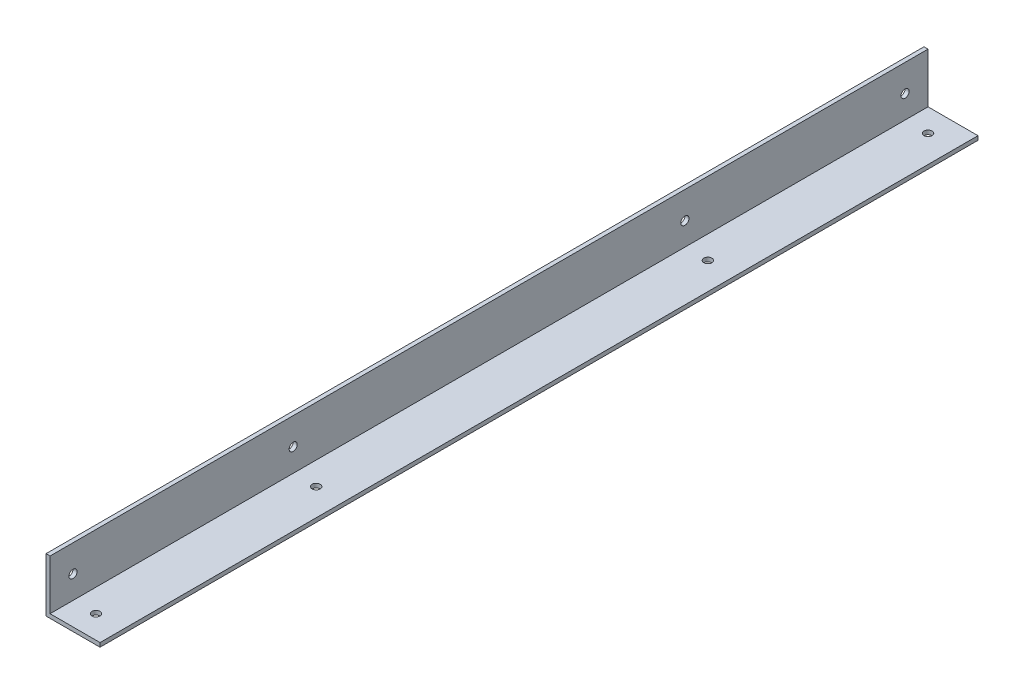
ISO-10303-21;
HEADER;
FILE_DESCRIPTION(('STEP AP214'),'2;1');
FILE_NAME('part.step','',(''),(''),'','','');
FILE_SCHEMA(('AUTOMOTIVE_DESIGN { 1 0 10303 214 1 1 1 1 }'));
ENDSEC;
DATA;
#1=APPLICATION_CONTEXT('core data for automotive mechanical design processes');
#2=APPLICATION_PROTOCOL_DEFINITION('international standard','automotive_design',2000,#1);
#3=PRODUCT_CONTEXT('',#1,'mechanical');
#4=PRODUCT('Part','Part','',(#3));
#5=PRODUCT_RELATED_PRODUCT_CATEGORY('part','',(#4));
#6=PRODUCT_DEFINITION_FORMATION('','',#4);
#7=PRODUCT_DEFINITION_CONTEXT('part definition',#1,'design');
#8=PRODUCT_DEFINITION('design','',#6,#7);
#9=PRODUCT_DEFINITION_SHAPE('','',#8);
#10=(LENGTH_UNIT() NAMED_UNIT(*) SI_UNIT(.MILLI.,.METRE.));
#11=(NAMED_UNIT(*) PLANE_ANGLE_UNIT() SI_UNIT($,.RADIAN.));
#12=(NAMED_UNIT(*) SI_UNIT($,.STERADIAN.) SOLID_ANGLE_UNIT());
#13=UNCERTAINTY_MEASURE_WITH_UNIT(LENGTH_MEASURE(1.E-05),#10,'distance_accuracy_value','');
#14=(GEOMETRIC_REPRESENTATION_CONTEXT(3) GLOBAL_UNCERTAINTY_ASSIGNED_CONTEXT((#13)) GLOBAL_UNIT_ASSIGNED_CONTEXT((#10,
#11,#12)) REPRESENTATION_CONTEXT('',''));
#15=CARTESIAN_POINT('',(0.,0.,0.));
#16=DIRECTION('',(0.,0.,1.));
#17=DIRECTION('',(1.,0.,0.));
#18=AXIS2_PLACEMENT_3D('',#15,#16,#17);
#19=CARTESIAN_POINT('',(-15.9316863798358,4.77336842105263,325.));
#20=DIRECTION('',(0.,-1.,0.));
#21=DIRECTION('',(1.,0.,0.));
#22=AXIS2_PLACEMENT_3D('',#19,#20,#21);
#23=PLANE('',#22);
#24=DIRECTION('',(-1.,0.,0.));
#25=VECTOR('',#24,1.);
#26=CARTESIAN_POINT('',(-15.9316863798358,4.77336842105263,0.));
#27=LINE('',#26,#25);
#28=CARTESIAN_POINT('',(-15.9316863798358,4.77336842105263,0.));
#29=VERTEX_POINT('',#28);
#30=CARTESIAN_POINT('',(-17.4316863798358,4.77336842105263,0.));
#31=VERTEX_POINT('',#30);
#32=EDGE_CURVE('E114',#29,#31,#27,.T.);
#33=ORIENTED_EDGE('',*,*,#32,.T.);
#34=DIRECTION('',(0.,0.,-1.));
#35=VECTOR('',#34,1.);
#36=CARTESIAN_POINT('',(-17.4316863798358,4.77336842105263,325.));
#37=LINE('',#36,#35);
#38=CARTESIAN_POINT('',(-17.4316863798358,4.77336842105263,325.));
#39=VERTEX_POINT('',#38);
#40=EDGE_CURVE('E11',#39,#31,#37,.T.);
#41=ORIENTED_EDGE('',*,*,#40,.F.);
#42=DIRECTION('',(-1.,0.,0.));
#43=VECTOR('',#42,1.);
#44=CARTESIAN_POINT('',(-15.9316863798358,4.77336842105263,325.));
#45=LINE('',#44,#43);
#46=CARTESIAN_POINT('',(-15.9316863798358,4.77336842105263,325.));
#47=VERTEX_POINT('',#46);
#48=EDGE_CURVE('E125',#47,#39,#45,.T.);
#49=ORIENTED_EDGE('',*,*,#48,.F.);
#50=DIRECTION('',(0.,0.,-1.));
#51=VECTOR('',#50,1.);
#52=CARTESIAN_POINT('',(-15.9316863798358,4.77336842105263,325.));
#53=LINE('',#52,#51);
#54=EDGE_CURVE('E110',#47,#29,#53,.T.);
#55=ORIENTED_EDGE('',*,*,#54,.T.);
#56=EDGE_LOOP('',(#33,#41,#49,#55));
#57=FACE_BOUND('',#56,.T.);
#58=ADVANCED_FACE('F30',(#57),#23,.F.);
#59=CARTESIAN_POINT('',(-17.4316863798358,4.77336842105263,325.));
#60=DIRECTION('',(1.,0.,0.));
#61=DIRECTION('',(0.,1.,0.));
#62=AXIS2_PLACEMENT_3D('',#59,#60,#61);
#63=PLANE('',#62);
#64=CARTESIAN_POINT('',(-17.4316863798358,-5.22663157894737,90.));
#65=DIRECTION('',(1.,0.,0.));
#66=DIRECTION('',(0.,1.,0.));
#67=AXIS2_PLACEMENT_3D('',#64,#65,#66);
#68=CIRCLE('',#67,1.5);
#69=CARTESIAN_POINT('',(-17.4316863798358,-3.72663157894737,90.));
#70=VERTEX_POINT('',#69);
#71=EDGE_CURVE('E287',#70,#70,#68,.T.);
#72=ORIENTED_EDGE('',*,*,#71,.T.);
#73=EDGE_LOOP('',(#72));
#74=FACE_BOUND('',#73,.T.);
#75=CARTESIAN_POINT('',(-17.4316863798358,-5.22663157894737,235.));
#76=DIRECTION('',(1.,0.,0.));
#77=DIRECTION('',(0.,1.,0.));
#78=AXIS2_PLACEMENT_3D('',#75,#76,#77);
#79=CIRCLE('',#78,1.50000000000003);
#80=CARTESIAN_POINT('',(-17.4316863798358,-3.72663157894734,235.));
#81=VERTEX_POINT('',#80);
#82=EDGE_CURVE('E291',#81,#81,#79,.T.);
#83=ORIENTED_EDGE('',*,*,#82,.T.);
#84=EDGE_LOOP('',(#83));
#85=FACE_BOUND('',#84,.T.);
#86=CARTESIAN_POINT('',(-17.4316863798358,-5.22663157894737,8.50000000000001));
#87=DIRECTION('',(1.,0.,0.));
#88=DIRECTION('',(0.,1.,0.));
#89=AXIS2_PLACEMENT_3D('',#86,#87,#88);
#90=CIRCLE('',#89,1.5);
#91=CARTESIAN_POINT('',(-17.4316863798358,-3.72663157894737,8.50000000000001));
#92=VERTEX_POINT('',#91);
#93=EDGE_CURVE('E300',#92,#92,#90,.T.);
#94=ORIENTED_EDGE('',*,*,#93,.T.);
#95=EDGE_LOOP('',(#94));
#96=FACE_BOUND('',#95,.T.);
#97=CARTESIAN_POINT('',(-17.4316863798358,-5.22663157894737,316.5));
#98=DIRECTION('',(1.,0.,0.));
#99=DIRECTION('',(0.,1.,0.));
#100=AXIS2_PLACEMENT_3D('',#97,#98,#99);
#101=CIRCLE('',#100,1.50000000000002);
#102=CARTESIAN_POINT('',(-17.4316863798358,-3.72663157894735,316.5));
#103=VERTEX_POINT('',#102);
#104=EDGE_CURVE('E306',#103,#103,#101,.T.);
#105=ORIENTED_EDGE('',*,*,#104,.T.);
#106=EDGE_LOOP('',(#105));
#107=FACE_BOUND('',#106,.T.);
#108=DIRECTION('',(0.,-1.,0.));
#109=VECTOR('',#108,1.);
#110=CARTESIAN_POINT('',(-17.4316863798358,4.77336842105263,0.));
#111=LINE('',#110,#109);
#112=CARTESIAN_POINT('',(-17.4316863798357,-15.2266315789474,0.));
#113=VERTEX_POINT('',#112);
#114=EDGE_CURVE('E117',#31,#113,#111,.T.);
#115=ORIENTED_EDGE('',*,*,#114,.T.);
#116=DIRECTION('',(0.,0.,-1.));
#117=VECTOR('',#116,1.);
#118=CARTESIAN_POINT('',(-17.4316863798357,-15.2266315789474,325.));
#119=LINE('',#118,#117);
#120=CARTESIAN_POINT('',(-17.4316863798357,-15.2266315789474,325.));
#121=VERTEX_POINT('',#120);
#122=EDGE_CURVE('E38',#121,#113,#119,.T.);
#123=ORIENTED_EDGE('',*,*,#122,.F.);
#124=DIRECTION('',(0.,-1.,0.));
#125=VECTOR('',#124,1.);
#126=CARTESIAN_POINT('',(-17.4316863798358,4.77336842105263,325.));
#127=LINE('',#126,#125);
#128=EDGE_CURVE('E83',#39,#121,#127,.T.);
#129=ORIENTED_EDGE('',*,*,#128,.F.);
#130=ORIENTED_EDGE('',*,*,#40,.T.);
#131=EDGE_LOOP('',(#115,#123,#129,#130));
#132=FACE_BOUND('',#131,.T.);
#133=ADVANCED_FACE('F153',(#74,#85,#96,#107,#132),#63,.F.);
#134=CARTESIAN_POINT('',(-17.4316863798357,-15.2266315789474,325.));
#135=DIRECTION('',(0.,1.,0.));
#136=DIRECTION('',(0.,0.,1.));
#137=AXIS2_PLACEMENT_3D('',#134,#135,#136);
#138=PLANE('',#137);
#139=CARTESIAN_POINT('',(-7.43168637983575,-15.2266315789474,90.));
#140=DIRECTION('',(0.,1.,0.));
#141=DIRECTION('',(0.,0.,1.));
#142=AXIS2_PLACEMENT_3D('',#139,#140,#141);
#143=CIRCLE('',#142,1.5);
#144=CARTESIAN_POINT('',(-7.43168637983575,-15.2266315789474,91.5));
#145=VERTEX_POINT('',#144);
#146=EDGE_CURVE('E312',#145,#145,#143,.T.);
#147=ORIENTED_EDGE('',*,*,#146,.T.);
#148=EDGE_LOOP('',(#147));
#149=FACE_BOUND('',#148,.T.);
#150=CARTESIAN_POINT('',(-7.43168637983575,-15.2266315789474,235.));
#151=DIRECTION('',(0.,1.,0.));
#152=DIRECTION('',(0.,0.,1.));
#153=AXIS2_PLACEMENT_3D('',#150,#151,#152);
#154=CIRCLE('',#153,1.5);
#155=CARTESIAN_POINT('',(-7.43168637983575,-15.2266315789474,236.5));
#156=VERTEX_POINT('',#155);
#157=EDGE_CURVE('E318',#156,#156,#154,.T.);
#158=ORIENTED_EDGE('',*,*,#157,.T.);
#159=EDGE_LOOP('',(#158));
#160=FACE_BOUND('',#159,.T.);
#161=CARTESIAN_POINT('',(-7.43168637983575,-15.2266315789474,316.5));
#162=DIRECTION('',(0.,1.,0.));
#163=DIRECTION('',(0.,0.,1.));
#164=AXIS2_PLACEMENT_3D('',#161,#162,#163);
#165=CIRCLE('',#164,1.5);
#166=CARTESIAN_POINT('',(-7.43168637983575,-15.2266315789474,318.));
#167=VERTEX_POINT('',#166);
#168=EDGE_CURVE('E324',#167,#167,#165,.T.);
#169=ORIENTED_EDGE('',*,*,#168,.T.);
#170=EDGE_LOOP('',(#169));
#171=FACE_BOUND('',#170,.T.);
#172=CARTESIAN_POINT('',(-7.43168637983575,-15.2266315789474,8.50000000000001));
#173=DIRECTION('',(0.,1.,0.));
#174=DIRECTION('',(0.,0.,1.));
#175=AXIS2_PLACEMENT_3D('',#172,#173,#174);
#176=CIRCLE('',#175,1.5);
#177=CARTESIAN_POINT('',(-7.43168637983575,-15.2266315789474,10.));
#178=VERTEX_POINT('',#177);
#179=EDGE_CURVE('E118',#178,#178,#176,.T.);
#180=ORIENTED_EDGE('',*,*,#179,.T.);
#181=EDGE_LOOP('',(#180));
#182=FACE_BOUND('',#181,.T.);
#183=DIRECTION('',(1.,0.,0.));
#184=VECTOR('',#183,1.);
#185=CARTESIAN_POINT('',(-17.4316863798357,-15.2266315789474,0.));
#186=LINE('',#185,#184);
#187=CARTESIAN_POINT('',(2.56831362016425,-15.2266315789474,0.));
#188=VERTEX_POINT('',#187);
#189=EDGE_CURVE('E120',#113,#188,#186,.T.);
#190=ORIENTED_EDGE('',*,*,#189,.T.);
#191=DIRECTION('',(0.,0.,-1.));
#192=VECTOR('',#191,1.);
#193=CARTESIAN_POINT('',(2.56831362016425,-15.2266315789474,325.));
#194=LINE('',#193,#192);
#195=CARTESIAN_POINT('',(2.56831362016425,-15.2266315789474,325.));
#196=VERTEX_POINT('',#195);
#197=EDGE_CURVE('E105',#196,#188,#194,.T.);
#198=ORIENTED_EDGE('',*,*,#197,.F.);
#199=DIRECTION('',(1.,0.,0.));
#200=VECTOR('',#199,1.);
#201=CARTESIAN_POINT('',(-17.4316863798357,-15.2266315789474,325.));
#202=LINE('',#201,#200);
#203=EDGE_CURVE('E96',#121,#196,#202,.T.);
#204=ORIENTED_EDGE('',*,*,#203,.F.);
#205=ORIENTED_EDGE('',*,*,#122,.T.);
#206=EDGE_LOOP('',(#190,#198,#204,#205));
#207=FACE_BOUND('',#206,.T.);
#208=ADVANCED_FACE('F131',(#149,#160,#171,#182,#207),#138,.F.);
#209=CARTESIAN_POINT('',(2.56831362016425,-15.2266315789474,325.));
#210=DIRECTION('',(-1.,0.,0.));
#211=DIRECTION('',(0.,0.,1.));
#212=AXIS2_PLACEMENT_3D('',#209,#210,#211);
#213=PLANE('',#212);
#214=DIRECTION('',(0.,1.,0.));
#215=VECTOR('',#214,1.);
#216=CARTESIAN_POINT('',(2.56831362016425,-15.2266315789474,0.));
#217=LINE('',#216,#215);
#218=CARTESIAN_POINT('',(2.56831362016425,-13.7266315789474,0.));
#219=VERTEX_POINT('',#218);
#220=EDGE_CURVE('E104',#188,#219,#217,.T.);
#221=ORIENTED_EDGE('',*,*,#220,.T.);
#222=DIRECTION('',(0.,0.,-1.));
#223=VECTOR('',#222,1.);
#224=CARTESIAN_POINT('',(2.56831362016425,-13.7266315789474,325.));
#225=LINE('',#224,#223);
#226=CARTESIAN_POINT('',(2.56831362016425,-13.7266315789474,325.));
#227=VERTEX_POINT('',#226);
#228=EDGE_CURVE('E101',#227,#219,#225,.T.);
#229=ORIENTED_EDGE('',*,*,#228,.F.);
#230=DIRECTION('',(0.,1.,0.));
#231=VECTOR('',#230,1.);
#232=CARTESIAN_POINT('',(2.56831362016425,-15.2266315789474,325.));
#233=LINE('',#232,#231);
#234=EDGE_CURVE('E90',#196,#227,#233,.T.);
#235=ORIENTED_EDGE('',*,*,#234,.F.);
#236=ORIENTED_EDGE('',*,*,#197,.T.);
#237=EDGE_LOOP('',(#221,#229,#235,#236));
#238=FACE_BOUND('',#237,.T.);
#239=ADVANCED_FACE('F102',(#238),#213,.F.);
#240=CARTESIAN_POINT('',(2.56831362016425,-13.7266315789474,325.));
#241=DIRECTION('',(0.,-1.,0.));
#242=DIRECTION('',(1.,0.,0.));
#243=AXIS2_PLACEMENT_3D('',#240,#241,#242);
#244=PLANE('',#243);
#245=CARTESIAN_POINT('',(-7.43168637983575,-13.7266315789474,90.));
#246=DIRECTION('',(0.,1.,0.));
#247=DIRECTION('',(-1.,0.,0.));
#248=AXIS2_PLACEMENT_3D('',#245,#246,#247);
#249=CIRCLE('',#248,1.5);
#250=CARTESIAN_POINT('',(-8.93168637983575,-13.7266315789474,90.));
#251=VERTEX_POINT('',#250);
#252=EDGE_CURVE('E309',#251,#251,#249,.T.);
#253=ORIENTED_EDGE('',*,*,#252,.F.);
#254=EDGE_LOOP('',(#253));
#255=FACE_BOUND('',#254,.T.);
#256=CARTESIAN_POINT('',(-7.43168637983575,-13.7266315789474,235.));
#257=DIRECTION('',(0.,1.,0.));
#258=DIRECTION('',(-1.,0.,0.));
#259=AXIS2_PLACEMENT_3D('',#256,#257,#258);
#260=CIRCLE('',#259,1.5);
#261=CARTESIAN_POINT('',(-8.93168637983575,-13.7266315789474,235.));
#262=VERTEX_POINT('',#261);
#263=EDGE_CURVE('E315',#262,#262,#260,.T.);
#264=ORIENTED_EDGE('',*,*,#263,.F.);
#265=EDGE_LOOP('',(#264));
#266=FACE_BOUND('',#265,.T.);
#267=CARTESIAN_POINT('',(-7.43168637983575,-13.7266315789474,316.5));
#268=DIRECTION('',(0.,1.,0.));
#269=DIRECTION('',(-1.,0.,0.));
#270=AXIS2_PLACEMENT_3D('',#267,#268,#269);
#271=CIRCLE('',#270,1.5);
#272=CARTESIAN_POINT('',(-8.93168637983575,-13.7266315789474,316.5));
#273=VERTEX_POINT('',#272);
#274=EDGE_CURVE('E321',#273,#273,#271,.T.);
#275=ORIENTED_EDGE('',*,*,#274,.F.);
#276=EDGE_LOOP('',(#275));
#277=FACE_BOUND('',#276,.T.);
#278=CARTESIAN_POINT('',(-7.43168637983575,-13.7266315789474,8.50000000000001));
#279=DIRECTION('',(0.,1.,0.));
#280=DIRECTION('',(-1.,0.,0.));
#281=AXIS2_PLACEMENT_3D('',#278,#279,#280);
#282=CIRCLE('',#281,1.5);
#283=CARTESIAN_POINT('',(-8.93168637983575,-13.7266315789474,8.50000000000001));
#284=VERTEX_POINT('',#283);
#285=EDGE_CURVE('E327',#284,#284,#282,.T.);
#286=ORIENTED_EDGE('',*,*,#285,.F.);
#287=EDGE_LOOP('',(#286));
#288=FACE_BOUND('',#287,.T.);
#289=DIRECTION('',(-1.,0.,0.));
#290=VECTOR('',#289,1.);
#291=CARTESIAN_POINT('',(2.56831362016425,-13.7266315789474,0.));
#292=LINE('',#291,#290);
#293=CARTESIAN_POINT('',(-15.9316863798358,-13.7266315789474,0.));
#294=VERTEX_POINT('',#293);
#295=EDGE_CURVE('E69',#219,#294,#292,.T.);
#296=ORIENTED_EDGE('',*,*,#295,.T.);
#297=DIRECTION('',(0.,0.,-1.));
#298=VECTOR('',#297,1.);
#299=CARTESIAN_POINT('',(-15.9316863798358,-13.7266315789474,325.));
#300=LINE('',#299,#298);
#301=CARTESIAN_POINT('',(-15.9316863798358,-13.7266315789474,325.));
#302=VERTEX_POINT('',#301);
#303=EDGE_CURVE('E106',#302,#294,#300,.T.);
#304=ORIENTED_EDGE('',*,*,#303,.F.);
#305=DIRECTION('',(-1.,0.,0.));
#306=VECTOR('',#305,1.);
#307=CARTESIAN_POINT('',(2.56831362016425,-13.7266315789474,325.));
#308=LINE('',#307,#306);
#309=EDGE_CURVE('E94',#227,#302,#308,.T.);
#310=ORIENTED_EDGE('',*,*,#309,.F.);
#311=ORIENTED_EDGE('',*,*,#228,.T.);
#312=EDGE_LOOP('',(#296,#304,#310,#311));
#313=FACE_BOUND('',#312,.T.);
#314=ADVANCED_FACE('F108',(#255,#266,#277,#288,#313),#244,.F.);
#315=CARTESIAN_POINT('',(-15.9316863798358,-13.7266315789474,325.));
#316=DIRECTION('',(-1.,0.,0.));
#317=DIRECTION('',(0.,0.,1.));
#318=AXIS2_PLACEMENT_3D('',#315,#316,#317);
#319=PLANE('',#318);
#320=CARTESIAN_POINT('',(-15.9316863798358,-5.22663157894737,90.));
#321=DIRECTION('',(1.,0.,0.));
#322=DIRECTION('',(0.,0.,-1.));
#323=AXIS2_PLACEMENT_3D('',#320,#321,#322);
#324=CIRCLE('',#323,1.5);
#325=CARTESIAN_POINT('',(-15.9316863798358,-5.22663157894737,88.5));
#326=VERTEX_POINT('',#325);
#327=EDGE_CURVE('E285',#326,#326,#324,.T.);
#328=ORIENTED_EDGE('',*,*,#327,.F.);
#329=EDGE_LOOP('',(#328));
#330=FACE_BOUND('',#329,.T.);
#331=CARTESIAN_POINT('',(-15.9316863798358,-5.22663157894737,235.));
#332=DIRECTION('',(1.,0.,0.));
#333=DIRECTION('',(0.,0.,-1.));
#334=AXIS2_PLACEMENT_3D('',#331,#332,#333);
#335=CIRCLE('',#334,1.50000000000003);
#336=CARTESIAN_POINT('',(-15.9316863798358,-5.22663157894737,233.5));
#337=VERTEX_POINT('',#336);
#338=EDGE_CURVE('E288',#337,#337,#335,.T.);
#339=ORIENTED_EDGE('',*,*,#338,.F.);
#340=EDGE_LOOP('',(#339));
#341=FACE_BOUND('',#340,.T.);
#342=CARTESIAN_POINT('',(-15.9316863798358,-5.22663157894737,8.50000000000001));
#343=DIRECTION('',(1.,0.,0.));
#344=DIRECTION('',(0.,0.,-1.));
#345=AXIS2_PLACEMENT_3D('',#342,#343,#344);
#346=CIRCLE('',#345,1.5);
#347=CARTESIAN_POINT('',(-15.9316863798358,-5.22663157894737,7.00000000000001));
#348=VERTEX_POINT('',#347);
#349=EDGE_CURVE('E297',#348,#348,#346,.T.);
#350=ORIENTED_EDGE('',*,*,#349,.F.);
#351=EDGE_LOOP('',(#350));
#352=FACE_BOUND('',#351,.T.);
#353=CARTESIAN_POINT('',(-15.9316863798358,-5.22663157894737,316.5));
#354=DIRECTION('',(1.,0.,0.));
#355=DIRECTION('',(0.,0.,-1.));
#356=AXIS2_PLACEMENT_3D('',#353,#354,#355);
#357=CIRCLE('',#356,1.50000000000002);
#358=CARTESIAN_POINT('',(-15.9316863798358,-5.22663157894737,315.));
#359=VERTEX_POINT('',#358);
#360=EDGE_CURVE('E303',#359,#359,#357,.T.);
#361=ORIENTED_EDGE('',*,*,#360,.F.);
#362=EDGE_LOOP('',(#361));
#363=FACE_BOUND('',#362,.T.);
#364=DIRECTION('',(0.,1.,0.));
#365=VECTOR('',#364,1.);
#366=CARTESIAN_POINT('',(-15.9316863798358,-13.7266315789474,0.));
#367=LINE('',#366,#365);
#368=EDGE_CURVE('E75',#294,#29,#367,.T.);
#369=ORIENTED_EDGE('',*,*,#368,.T.);
#370=ORIENTED_EDGE('',*,*,#54,.F.);
#371=DIRECTION('',(0.,1.,0.));
#372=VECTOR('',#371,1.);
#373=CARTESIAN_POINT('',(-15.9316863798358,-13.7266315789474,325.));
#374=LINE('',#373,#372);
#375=EDGE_CURVE('E46',#302,#47,#374,.T.);
#376=ORIENTED_EDGE('',*,*,#375,.F.);
#377=ORIENTED_EDGE('',*,*,#303,.T.);
#378=EDGE_LOOP('',(#369,#370,#376,#377));
#379=FACE_BOUND('',#378,.T.);
#380=ADVANCED_FACE('F138',(#330,#341,#352,#363,#379),#319,.F.);
#381=CARTESIAN_POINT('',(-17.4316863798358,4.77336842105263,325.));
#382=DIRECTION('',(0.,0.,1.));
#383=DIRECTION('',(1.,0.,0.));
#384=AXIS2_PLACEMENT_3D('',#381,#382,#383);
#385=PLANE('',#384);
#386=ORIENTED_EDGE('',*,*,#48,.T.);
#387=ORIENTED_EDGE('',*,*,#128,.T.);
#388=ORIENTED_EDGE('',*,*,#203,.T.);
#389=ORIENTED_EDGE('',*,*,#234,.T.);
#390=ORIENTED_EDGE('',*,*,#309,.T.);
#391=ORIENTED_EDGE('',*,*,#375,.T.);
#392=EDGE_LOOP('',(#386,#387,#388,#389,#390,#391));
#393=FACE_BOUND('',#392,.T.);
#394=ADVANCED_FACE('F92',(#393),#385,.T.);
#395=CARTESIAN_POINT('',(-17.4316863798358,4.77336842105263,0.));
#396=DIRECTION('',(0.,0.,1.));
#397=DIRECTION('',(1.,0.,0.));
#398=AXIS2_PLACEMENT_3D('',#395,#396,#397);
#399=PLANE('',#398);
#400=ORIENTED_EDGE('',*,*,#32,.F.);
#401=ORIENTED_EDGE('',*,*,#368,.F.);
#402=ORIENTED_EDGE('',*,*,#295,.F.);
#403=ORIENTED_EDGE('',*,*,#220,.F.);
#404=ORIENTED_EDGE('',*,*,#189,.F.);
#405=ORIENTED_EDGE('',*,*,#114,.F.);
#406=EDGE_LOOP('',(#400,#401,#402,#403,#404,#405));
#407=FACE_BOUND('',#406,.T.);
#408=ADVANCED_FACE('F134',(#407),#399,.F.);
#409=CARTESIAN_POINT('',(-7.43168637983563,-313.726631578947,8.50000000000001));
#410=DIRECTION('',(0.,1.,0.));
#411=DIRECTION('',(-1.,0.,0.));
#412=AXIS2_PLACEMENT_3D('',#409,#410,#411);
#413=CYLINDRICAL_SURFACE('',#412,1.5);
#414=ORIENTED_EDGE('',*,*,#285,.T.);
#415=EDGE_LOOP('',(#414));
#416=FACE_BOUND('',#415,.T.);
#417=ORIENTED_EDGE('',*,*,#179,.F.);
#418=EDGE_LOOP('',(#417));
#419=FACE_BOUND('',#418,.T.);
#420=ADVANCED_FACE('F185',(#416,#419),#413,.F.);
#421=CARTESIAN_POINT('',(-7.43168637983563,-313.726631578947,316.5));
#422=DIRECTION('',(0.,1.,0.));
#423=DIRECTION('',(-1.,0.,0.));
#424=AXIS2_PLACEMENT_3D('',#421,#422,#423);
#425=CYLINDRICAL_SURFACE('',#424,1.5);
#426=ORIENTED_EDGE('',*,*,#274,.T.);
#427=EDGE_LOOP('',(#426));
#428=FACE_BOUND('',#427,.T.);
#429=ORIENTED_EDGE('',*,*,#168,.F.);
#430=EDGE_LOOP('',(#429));
#431=FACE_BOUND('',#430,.T.);
#432=ADVANCED_FACE('F190',(#428,#431),#425,.F.);
#433=CARTESIAN_POINT('',(-7.43168637983563,-313.726631578947,235.));
#434=DIRECTION('',(0.,1.,0.));
#435=DIRECTION('',(-1.,0.,0.));
#436=AXIS2_PLACEMENT_3D('',#433,#434,#435);
#437=CYLINDRICAL_SURFACE('',#436,1.5);
#438=ORIENTED_EDGE('',*,*,#263,.T.);
#439=EDGE_LOOP('',(#438));
#440=FACE_BOUND('',#439,.T.);
#441=ORIENTED_EDGE('',*,*,#157,.F.);
#442=EDGE_LOOP('',(#441));
#443=FACE_BOUND('',#442,.T.);
#444=ADVANCED_FACE('F202',(#440,#443),#437,.F.);
#445=CARTESIAN_POINT('',(-7.43168637983563,-313.726631578947,90.));
#446=DIRECTION('',(0.,1.,0.));
#447=DIRECTION('',(-1.,0.,0.));
#448=AXIS2_PLACEMENT_3D('',#445,#446,#447);
#449=CYLINDRICAL_SURFACE('',#448,1.5);
#450=ORIENTED_EDGE('',*,*,#252,.T.);
#451=EDGE_LOOP('',(#450));
#452=FACE_BOUND('',#451,.T.);
#453=ORIENTED_EDGE('',*,*,#146,.F.);
#454=EDGE_LOOP('',(#453));
#455=FACE_BOUND('',#454,.T.);
#456=ADVANCED_FACE('F212',(#452,#455),#449,.F.);
#457=CARTESIAN_POINT('',(-315.931686379836,-5.22663157894737,316.5));
#458=DIRECTION('',(1.,0.,0.));
#459=DIRECTION('',(0.,0.,-1.));
#460=AXIS2_PLACEMENT_3D('',#457,#458,#459);
#461=CYLINDRICAL_SURFACE('',#460,1.50000000000002);
#462=ORIENTED_EDGE('',*,*,#360,.T.);
#463=EDGE_LOOP('',(#462));
#464=FACE_BOUND('',#463,.T.);
#465=ORIENTED_EDGE('',*,*,#104,.F.);
#466=EDGE_LOOP('',(#465));
#467=FACE_BOUND('',#466,.T.);
#468=ADVANCED_FACE('F221',(#464,#467),#461,.F.);
#469=CARTESIAN_POINT('',(-315.931686379836,-5.22663157894737,8.50000000000001));
#470=DIRECTION('',(1.,0.,0.));
#471=DIRECTION('',(0.,0.,-1.));
#472=AXIS2_PLACEMENT_3D('',#469,#470,#471);
#473=CYLINDRICAL_SURFACE('',#472,1.5);
#474=ORIENTED_EDGE('',*,*,#349,.T.);
#475=EDGE_LOOP('',(#474));
#476=FACE_BOUND('',#475,.T.);
#477=ORIENTED_EDGE('',*,*,#93,.F.);
#478=EDGE_LOOP('',(#477));
#479=FACE_BOUND('',#478,.T.);
#480=ADVANCED_FACE('F241',(#476,#479),#473,.F.);
#481=CARTESIAN_POINT('',(-315.931686379836,-5.22663157894737,235.));
#482=DIRECTION('',(1.,0.,0.));
#483=DIRECTION('',(0.,0.,-1.));
#484=AXIS2_PLACEMENT_3D('',#481,#482,#483);
#485=CYLINDRICAL_SURFACE('',#484,1.50000000000003);
#486=ORIENTED_EDGE('',*,*,#338,.T.);
#487=EDGE_LOOP('',(#486));
#488=FACE_BOUND('',#487,.T.);
#489=ORIENTED_EDGE('',*,*,#82,.F.);
#490=EDGE_LOOP('',(#489));
#491=FACE_BOUND('',#490,.T.);
#492=ADVANCED_FACE('F251',(#488,#491),#485,.F.);
#493=CARTESIAN_POINT('',(-315.931686379836,-5.22663157894737,90.));
#494=DIRECTION('',(1.,0.,0.));
#495=DIRECTION('',(0.,0.,-1.));
#496=AXIS2_PLACEMENT_3D('',#493,#494,#495);
#497=CYLINDRICAL_SURFACE('',#496,1.5);
#498=ORIENTED_EDGE('',*,*,#327,.T.);
#499=EDGE_LOOP('',(#498));
#500=FACE_BOUND('',#499,.T.);
#501=ORIENTED_EDGE('',*,*,#71,.F.);
#502=EDGE_LOOP('',(#501));
#503=FACE_BOUND('',#502,.T.);
#504=ADVANCED_FACE('F261',(#500,#503),#497,.F.);
#505=CLOSED_SHELL('',(#58,#133,#208,#239,#314,#380,#394,#408,#420,#432,#444,#456,#468,#480,#492,#504));
#506=MANIFOLD_SOLID_BREP('B2',#505);
#507=ADVANCED_BREP_SHAPE_REPRESENTATION('',(#18,#506),#14);
#508=SHAPE_DEFINITION_REPRESENTATION(#9,#507);
ENDSEC;
END-ISO-10303-21;
